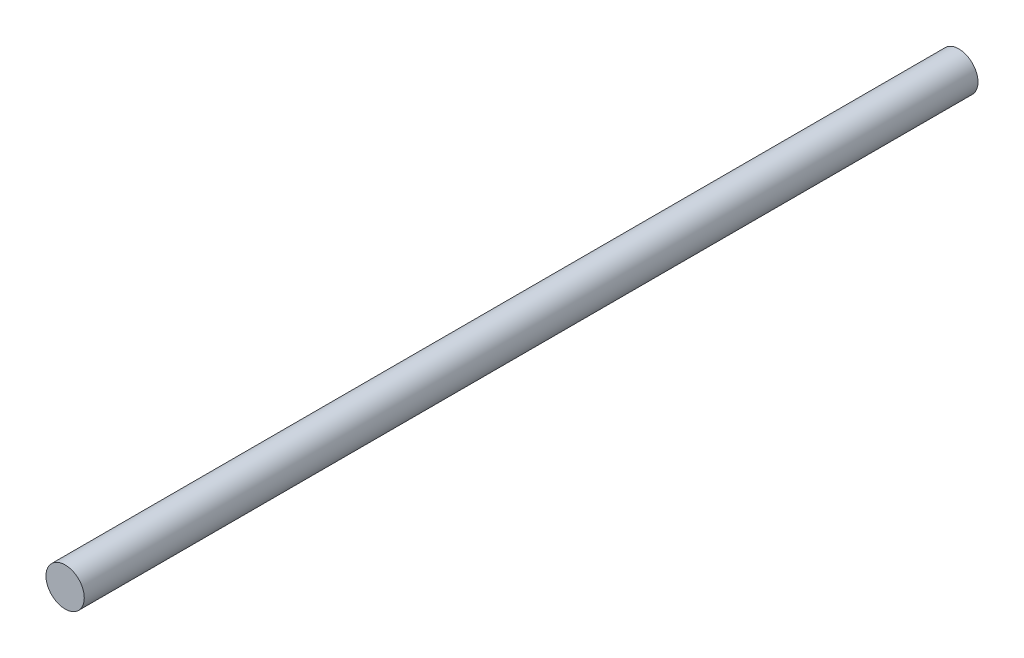
ISO-10303-21;
HEADER;
FILE_DESCRIPTION(('STEP AP214'),'2;1');
FILE_NAME('part.step','',(''),(''),'','','');
FILE_SCHEMA(('AUTOMOTIVE_DESIGN { 1 0 10303 214 1 1 1 1 }'));
ENDSEC;
DATA;
#1=APPLICATION_CONTEXT('core data for automotive mechanical design processes');
#2=APPLICATION_PROTOCOL_DEFINITION('international standard','automotive_design',2000,#1);
#3=PRODUCT_CONTEXT('',#1,'mechanical');
#4=PRODUCT('Part','Part','',(#3));
#5=PRODUCT_RELATED_PRODUCT_CATEGORY('part','',(#4));
#6=PRODUCT_DEFINITION_FORMATION('','',#4);
#7=PRODUCT_DEFINITION_CONTEXT('part definition',#1,'design');
#8=PRODUCT_DEFINITION('design','',#6,#7);
#9=PRODUCT_DEFINITION_SHAPE('','',#8);
#10=(LENGTH_UNIT() NAMED_UNIT(*) SI_UNIT(.MILLI.,.METRE.));
#11=(NAMED_UNIT(*) PLANE_ANGLE_UNIT() SI_UNIT($,.RADIAN.));
#12=(NAMED_UNIT(*) SI_UNIT($,.STERADIAN.) SOLID_ANGLE_UNIT());
#13=UNCERTAINTY_MEASURE_WITH_UNIT(LENGTH_MEASURE(1.E-05),#10,'distance_accuracy_value','');
#14=(GEOMETRIC_REPRESENTATION_CONTEXT(3) GLOBAL_UNCERTAINTY_ASSIGNED_CONTEXT((#13)) GLOBAL_UNIT_ASSIGNED_CONTEXT((#10,
#11,#12)) REPRESENTATION_CONTEXT('',''));
#15=CARTESIAN_POINT('',(0.,0.,0.));
#16=DIRECTION('',(0.,0.,1.));
#17=DIRECTION('',(1.,0.,0.));
#18=AXIS2_PLACEMENT_3D('',#15,#16,#17);
#19=CARTESIAN_POINT('',(0.,0.,70.));
#20=DIRECTION('',(0.,0.,-1.));
#21=DIRECTION('',(-1.,0.,0.));
#22=AXIS2_PLACEMENT_3D('',#19,#20,#21);
#23=CYLINDRICAL_SURFACE('',#22,1.5);
#24=CARTESIAN_POINT('',(0.,0.,70.));
#25=DIRECTION('',(0.,0.,1.));
#26=DIRECTION('',(1.,0.,0.));
#27=AXIS2_PLACEMENT_3D('',#24,#25,#26);
#28=CIRCLE('',#27,1.5);
#29=CARTESIAN_POINT('',(1.5,0.,70.));
#30=VERTEX_POINT('',#29);
#31=EDGE_CURVE('E10',#30,#30,#28,.T.);
#32=ORIENTED_EDGE('',*,*,#31,.F.);
#33=EDGE_LOOP('',(#32));
#34=FACE_BOUND('',#33,.T.);
#35=CARTESIAN_POINT('',(0.,0.,0.));
#36=DIRECTION('',(0.,0.,1.));
#37=DIRECTION('',(1.,0.,0.));
#38=AXIS2_PLACEMENT_3D('',#35,#36,#37);
#39=CIRCLE('',#38,1.5);
#40=CARTESIAN_POINT('',(1.5,0.,0.));
#41=VERTEX_POINT('',#40);
#42=EDGE_CURVE('E37',#41,#41,#39,.T.);
#43=ORIENTED_EDGE('',*,*,#42,.T.);
#44=EDGE_LOOP('',(#43));
#45=FACE_BOUND('',#44,.T.);
#46=ADVANCED_FACE('F34',(#34,#45),#23,.T.);
#47=CARTESIAN_POINT('',(0.,0.,70.));
#48=DIRECTION('',(0.,0.,1.));
#49=DIRECTION('',(1.,0.,0.));
#50=AXIS2_PLACEMENT_3D('',#47,#48,#49);
#51=PLANE('',#50);
#52=ORIENTED_EDGE('',*,*,#31,.T.);
#53=EDGE_LOOP('',(#52));
#54=FACE_BOUND('',#53,.T.);
#55=ADVANCED_FACE('F49',(#54),#51,.T.);
#56=CARTESIAN_POINT('',(0.,0.,0.));
#57=DIRECTION('',(0.,0.,1.));
#58=DIRECTION('',(1.,0.,0.));
#59=AXIS2_PLACEMENT_3D('',#56,#57,#58);
#60=PLANE('',#59);
#61=ORIENTED_EDGE('',*,*,#42,.F.);
#62=EDGE_LOOP('',(#61));
#63=FACE_BOUND('',#62,.T.);
#64=ADVANCED_FACE('F47',(#63),#60,.F.);
#65=CLOSED_SHELL('',(#46,#55,#64));
#66=MANIFOLD_SOLID_BREP('B2',#65);
#67=ADVANCED_BREP_SHAPE_REPRESENTATION('',(#18,#66),#14);
#68=SHAPE_DEFINITION_REPRESENTATION(#9,#67);
ENDSEC;
END-ISO-10303-21;
